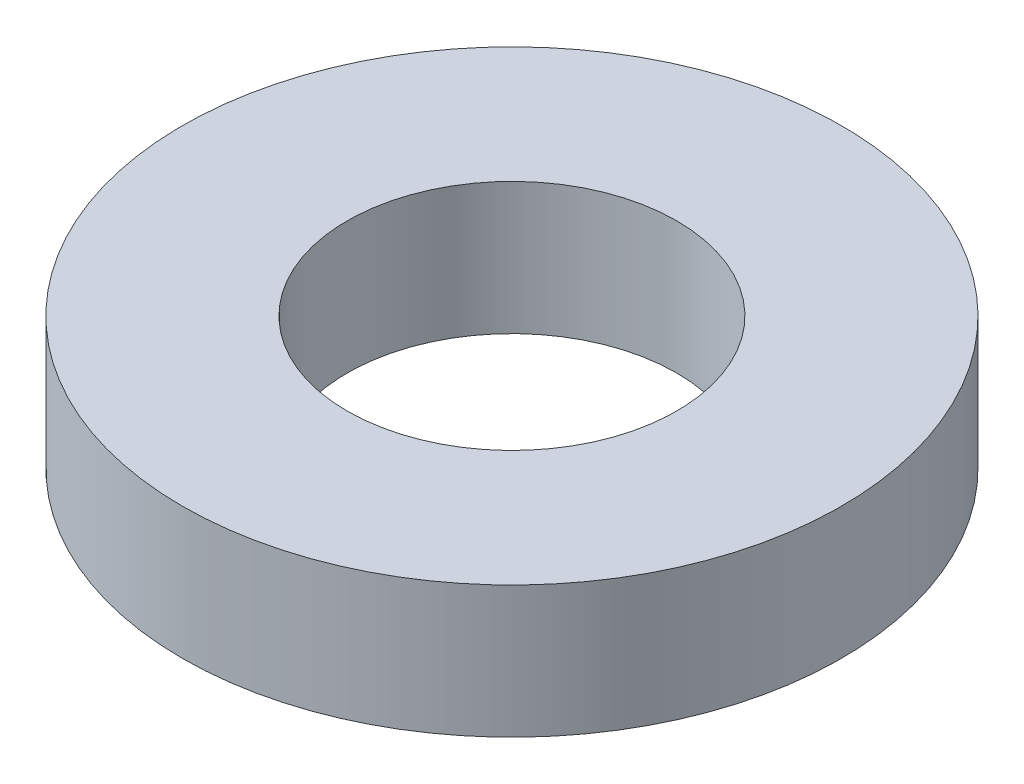
ISO-10303-21;
HEADER;
FILE_DESCRIPTION(('STEP AP214'),'2;1');
FILE_NAME('part.step','',(''),(''),'','','');
FILE_SCHEMA(('AUTOMOTIVE_DESIGN { 1 0 10303 214 1 1 1 1 }'));
ENDSEC;
DATA;
#1=APPLICATION_CONTEXT('core data for automotive mechanical design processes');
#2=APPLICATION_PROTOCOL_DEFINITION('international standard','automotive_design',2000,#1);
#3=PRODUCT_CONTEXT('',#1,'mechanical');
#4=PRODUCT('Part','Part','',(#3));
#5=PRODUCT_RELATED_PRODUCT_CATEGORY('part','',(#4));
#6=PRODUCT_DEFINITION_FORMATION('','',#4);
#7=PRODUCT_DEFINITION_CONTEXT('part definition',#1,'design');
#8=PRODUCT_DEFINITION('design','',#6,#7);
#9=PRODUCT_DEFINITION_SHAPE('','',#8);
#10=(LENGTH_UNIT() NAMED_UNIT(*) SI_UNIT(.MILLI.,.METRE.));
#11=(NAMED_UNIT(*) PLANE_ANGLE_UNIT() SI_UNIT($,.RADIAN.));
#12=(NAMED_UNIT(*) SI_UNIT($,.STERADIAN.) SOLID_ANGLE_UNIT());
#13=UNCERTAINTY_MEASURE_WITH_UNIT(LENGTH_MEASURE(1.E-05),#10,'distance_accuracy_value','');
#14=(GEOMETRIC_REPRESENTATION_CONTEXT(3) GLOBAL_UNCERTAINTY_ASSIGNED_CONTEXT((#13)) GLOBAL_UNIT_ASSIGNED_CONTEXT((#10,
#11,#12)) REPRESENTATION_CONTEXT('',''));
#15=CARTESIAN_POINT('',(0.,0.,0.));
#16=DIRECTION('',(0.,0.,1.));
#17=DIRECTION('',(1.,0.,0.));
#18=AXIS2_PLACEMENT_3D('',#15,#16,#17);
#19=CARTESIAN_POINT('',(0.,2.54,0.));
#20=DIRECTION('',(0.,-1.,0.));
#21=DIRECTION('',(0.,0.,-1.));
#22=AXIS2_PLACEMENT_3D('',#19,#20,#21);
#23=CYLINDRICAL_SURFACE('',#22,6.35);
#24=CARTESIAN_POINT('',(0.,2.54,0.));
#25=DIRECTION('',(0.,1.,0.));
#26=DIRECTION('',(0.,0.,1.));
#27=AXIS2_PLACEMENT_3D('',#24,#25,#26);
#28=CIRCLE('',#27,6.35);
#29=CARTESIAN_POINT('',(0.,2.54,6.35));
#30=VERTEX_POINT('',#29);
#31=EDGE_CURVE('E10',#30,#30,#28,.T.);
#32=ORIENTED_EDGE('',*,*,#31,.F.);
#33=EDGE_LOOP('',(#32));
#34=FACE_BOUND('',#33,.T.);
#35=CARTESIAN_POINT('',(0.,0.,0.));
#36=DIRECTION('',(0.,1.,0.));
#37=DIRECTION('',(0.,0.,1.));
#38=AXIS2_PLACEMENT_3D('',#35,#36,#37);
#39=CIRCLE('',#38,6.35);
#40=CARTESIAN_POINT('',(0.,0.,6.35));
#41=VERTEX_POINT('',#40);
#42=EDGE_CURVE('E39',#41,#41,#39,.T.);
#43=ORIENTED_EDGE('',*,*,#42,.T.);
#44=EDGE_LOOP('',(#43));
#45=FACE_BOUND('',#44,.T.);
#46=ADVANCED_FACE('F36',(#34,#45),#23,.T.);
#47=CARTESIAN_POINT('',(0.,2.54,0.));
#48=DIRECTION('',(0.,1.,0.));
#49=DIRECTION('',(0.,0.,1.));
#50=AXIS2_PLACEMENT_3D('',#47,#48,#49);
#51=PLANE('',#50);
#52=CARTESIAN_POINT('',(0.,2.54,0.));
#53=DIRECTION('',(0.,1.,0.));
#54=DIRECTION('',(0.,0.,1.));
#55=AXIS2_PLACEMENT_3D('',#52,#53,#54);
#56=CIRCLE('',#55,3.175);
#57=CARTESIAN_POINT('',(0.,2.54,3.175));
#58=VERTEX_POINT('',#57);
#59=EDGE_CURVE('E50',#58,#58,#56,.T.);
#60=ORIENTED_EDGE('',*,*,#59,.F.);
#61=EDGE_LOOP('',(#60));
#62=FACE_BOUND('',#61,.T.);
#63=ORIENTED_EDGE('',*,*,#31,.T.);
#64=EDGE_LOOP('',(#63));
#65=FACE_BOUND('',#64,.T.);
#66=ADVANCED_FACE('F56',(#62,#65),#51,.T.);
#67=CARTESIAN_POINT('',(0.,0.,0.));
#68=DIRECTION('',(0.,1.,0.));
#69=DIRECTION('',(0.,0.,1.));
#70=AXIS2_PLACEMENT_3D('',#67,#68,#69);
#71=PLANE('',#70);
#72=CARTESIAN_POINT('',(0.,0.,0.));
#73=DIRECTION('',(0.,1.,0.));
#74=DIRECTION('',(0.,0.,1.));
#75=AXIS2_PLACEMENT_3D('',#72,#73,#74);
#76=CIRCLE('',#75,3.175);
#77=CARTESIAN_POINT('',(0.,0.,3.175));
#78=VERTEX_POINT('',#77);
#79=EDGE_CURVE('E46',#78,#78,#76,.F.);
#80=ORIENTED_EDGE('',*,*,#79,.F.);
#81=EDGE_LOOP('',(#80));
#82=FACE_BOUND('',#81,.T.);
#83=ORIENTED_EDGE('',*,*,#42,.F.);
#84=EDGE_LOOP('',(#83));
#85=FACE_BOUND('',#84,.T.);
#86=ADVANCED_FACE('F58',(#82,#85),#71,.F.);
#87=CARTESIAN_POINT('',(0.,-8.98025612106915,0.));
#88=DIRECTION('',(0.,1.,0.));
#89=DIRECTION('',(0.,0.,1.));
#90=AXIS2_PLACEMENT_3D('',#87,#88,#89);
#91=CYLINDRICAL_SURFACE('',#90,3.175);
#92=ORIENTED_EDGE('',*,*,#79,.T.);
#93=EDGE_LOOP('',(#92));
#94=FACE_BOUND('',#93,.T.);
#95=ORIENTED_EDGE('',*,*,#59,.T.);
#96=EDGE_LOOP('',(#95));
#97=FACE_BOUND('',#96,.T.);
#98=ADVANCED_FACE('F54',(#94,#97),#91,.F.);
#99=CLOSED_SHELL('',(#46,#66,#86,#98));
#100=MANIFOLD_SOLID_BREP('B2',#99);
#101=ADVANCED_BREP_SHAPE_REPRESENTATION('',(#18,#100),#14);
#102=SHAPE_DEFINITION_REPRESENTATION(#9,#101);
ENDSEC;
END-ISO-10303-21;
